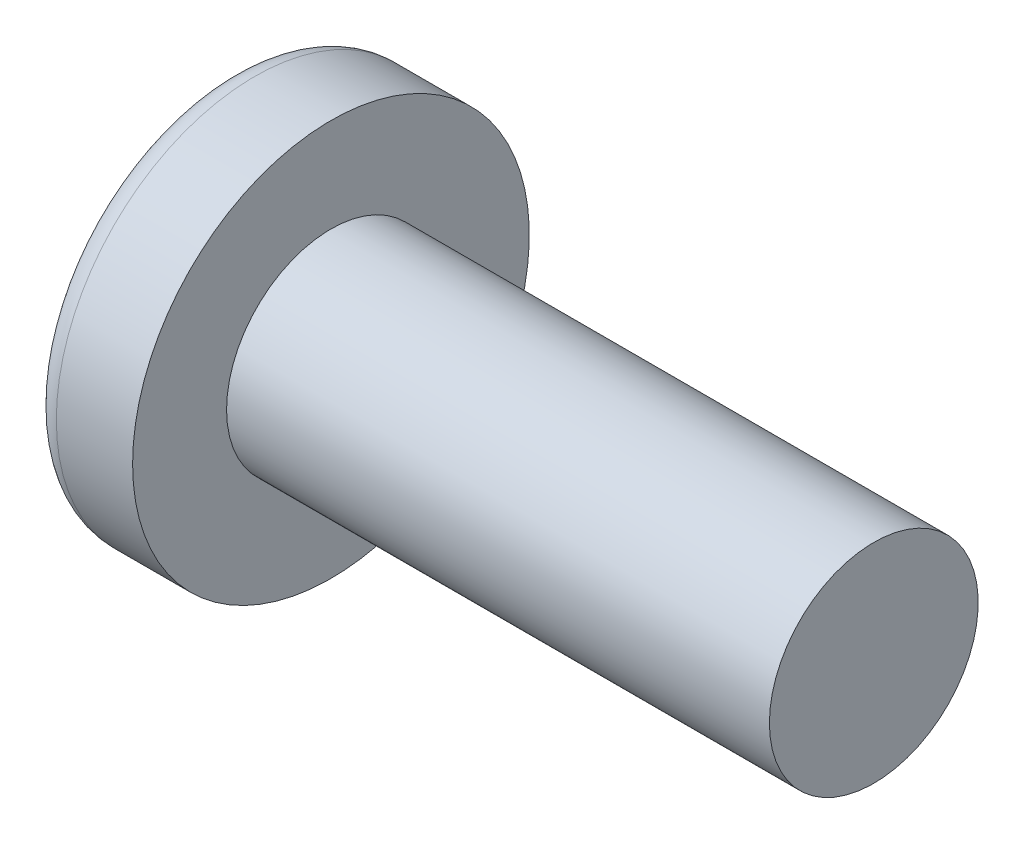
ISO-10303-21;
HEADER;
FILE_DESCRIPTION(('STEP AP214'),'2;1');
FILE_NAME('part.step','',(''),(''),'','','');
FILE_SCHEMA(('AUTOMOTIVE_DESIGN { 1 0 10303 214 1 1 1 1 }'));
ENDSEC;
DATA;
#1=APPLICATION_CONTEXT('core data for automotive mechanical design processes');
#2=APPLICATION_PROTOCOL_DEFINITION('international standard','automotive_design',2000,#1);
#3=PRODUCT_CONTEXT('',#1,'mechanical');
#4=PRODUCT('Part','Part','',(#3));
#5=PRODUCT_RELATED_PRODUCT_CATEGORY('part','',(#4));
#6=PRODUCT_DEFINITION_FORMATION('','',#4);
#7=PRODUCT_DEFINITION_CONTEXT('part definition',#1,'design');
#8=PRODUCT_DEFINITION('design','',#6,#7);
#9=PRODUCT_DEFINITION_SHAPE('','',#8);
#10=(LENGTH_UNIT() NAMED_UNIT(*) SI_UNIT(.MILLI.,.METRE.));
#11=(NAMED_UNIT(*) PLANE_ANGLE_UNIT() SI_UNIT($,.RADIAN.));
#12=(NAMED_UNIT(*) SI_UNIT($,.STERADIAN.) SOLID_ANGLE_UNIT());
#13=UNCERTAINTY_MEASURE_WITH_UNIT(LENGTH_MEASURE(1.E-05),#10,'distance_accuracy_value','');
#14=(GEOMETRIC_REPRESENTATION_CONTEXT(3) GLOBAL_UNCERTAINTY_ASSIGNED_CONTEXT((#13)) GLOBAL_UNIT_ASSIGNED_CONTEXT((#10,
#11,#12)) REPRESENTATION_CONTEXT('',''));
#15=CARTESIAN_POINT('',(0.,0.,0.));
#16=DIRECTION('',(0.,0.,1.));
#17=DIRECTION('',(1.,0.,0.));
#18=AXIS2_PLACEMENT_3D('',#15,#16,#17);
#19=CARTESIAN_POINT('',(8.,0.,0.));
#20=DIRECTION('',(-1.,0.,0.));
#21=DIRECTION('',(0.,1.,0.));
#22=AXIS2_PLACEMENT_3D('',#19,#20,#21);
#23=SPHERICAL_SURFACE('',#22,8.);
#24=CARTESIAN_POINT('',(1.37644815778014,0.,0.));
#25=DIRECTION('',(-1.,0.,0.));
#26=DIRECTION('',(0.,0.,1.));
#27=AXIS2_PLACEMENT_3D('',#24,#25,#26);
#28=CIRCLE('',#27,4.48648648648649);
#29=CARTESIAN_POINT('',(1.37644815778014,0.,4.48648648648649));
#30=VERTEX_POINT('',#29);
#31=EDGE_CURVE('E153',#30,#30,#28,.T.);
#32=ORIENTED_EDGE('',*,*,#31,.T.);
#33=EDGE_LOOP('',(#32));
#34=FACE_BOUND('',#33,.T.);
#35=CARTESIAN_POINT('',(7.98502567027952,-0.176697090701654,0.));
#36=DIRECTION('',(-0.0844430766861806,-0.996428304896931,0.));
#37=DIRECTION('',(0.996428304896931,-0.0844430766861806,0.));
#38=AXIS2_PLACEMENT_3D('',#35,#36,#37);
#39=CIRCLE('',#38,7.99803437774476);
#40=CARTESIAN_POINT('',(0.325131322777776,0.472446498069672,2.20752918301319));
#41=VERTEX_POINT('',#40);
#42=CARTESIAN_POINT('',(0.0309826509964153,0.497374351610472,0.497374351610473));
#43=VERTEX_POINT('',#42);
#44=EDGE_CURVE('E184',#41,#43,#39,.T.);
#45=ORIENTED_EDGE('',*,*,#44,.F.);
#46=CARTESIAN_POINT('',(6.31497138637622,0.,-2.25947018645006));
#47=DIRECTION('',(0.597823879730417,0.,0.801627475093059));
#48=DIRECTION('',(0.801627475093059,0.,-0.597823879730417));
#49=AXIS2_PLACEMENT_3D('',#46,#47,#48);
#50=CIRCLE('',#49,7.48702030502205);
#51=CARTESIAN_POINT('',(0.325131322777776,-0.472446498069688,2.20752918301319));
#52=VERTEX_POINT('',#51);
#53=EDGE_CURVE('E149',#41,#52,#50,.T.);
#54=ORIENTED_EDGE('',*,*,#53,.T.);
#55=CARTESIAN_POINT('',(7.98502567027952,0.176697090701654,0.));
#56=DIRECTION('',(-0.0844430766861805,0.996428304896931,0.));
#57=DIRECTION('',(-0.996428304896931,-0.0844430766861805,0.));
#58=AXIS2_PLACEMENT_3D('',#55,#56,#57);
#59=CIRCLE('',#58,7.99803437774476);
#60=CARTESIAN_POINT('',(0.0309826509964153,-0.497374351610475,0.497374351610473));
#61=VERTEX_POINT('',#60);
#62=EDGE_CURVE('E105',#61,#52,#59,.T.);
#63=ORIENTED_EDGE('',*,*,#62,.F.);
#64=CARTESIAN_POINT('',(7.98502567027952,0.,-0.176697090701654));
#65=DIRECTION('',(-0.0844430766861805,0.,-0.996428304896931));
#66=DIRECTION('',(-0.996428304896931,0.,0.0844430766861805));
#67=AXIS2_PLACEMENT_3D('',#64,#65,#66);
#68=CIRCLE('',#67,7.99803437774476);
#69=CARTESIAN_POINT('',(0.325131322777773,-2.20752918301319,0.47244649806968));
#70=VERTEX_POINT('',#69);
#71=EDGE_CURVE('E130',#70,#61,#68,.T.);
#72=ORIENTED_EDGE('',*,*,#71,.F.);
#73=CARTESIAN_POINT('',(6.31497138637622,2.25947018645006,0.));
#74=DIRECTION('',(0.597823879730417,-0.801627475093059,0.));
#75=DIRECTION('',(0.801627475093059,0.597823879730417,0.));
#76=AXIS2_PLACEMENT_3D('',#73,#74,#75);
#77=CIRCLE('',#76,7.48702030502205);
#78=CARTESIAN_POINT('',(0.325131322777775,-2.20752918301319,-0.47244649806968));
#79=VERTEX_POINT('',#78);
#80=EDGE_CURVE('E138',#70,#79,#77,.T.);
#81=ORIENTED_EDGE('',*,*,#80,.T.);
#82=CARTESIAN_POINT('',(7.98502567027952,0.,0.176697090701654));
#83=DIRECTION('',(-0.0844430766861806,0.,0.996428304896931));
#84=DIRECTION('',(0.996428304896931,0.,0.0844430766861806));
#85=AXIS2_PLACEMENT_3D('',#82,#83,#84);
#86=CIRCLE('',#85,7.99803437774476);
#87=CARTESIAN_POINT('',(0.0309826509964153,-0.497374351610471,-0.497374351610473));
#88=VERTEX_POINT('',#87);
#89=EDGE_CURVE('E48',#88,#79,#86,.T.);
#90=ORIENTED_EDGE('',*,*,#89,.F.);
#91=CARTESIAN_POINT('',(0.325131322777773,-0.472446498069672,-2.20752918301319));
#92=VERTEX_POINT('',#91);
#93=EDGE_CURVE('E191',#92,#88,#59,.T.);
#94=ORIENTED_EDGE('',*,*,#93,.F.);
#95=CARTESIAN_POINT('',(6.31497138637622,0.,2.25947018645006));
#96=DIRECTION('',(0.597823879730417,0.,-0.801627475093059));
#97=DIRECTION('',(-0.801627475093059,0.,-0.597823879730417));
#98=AXIS2_PLACEMENT_3D('',#95,#96,#97);
#99=CIRCLE('',#98,7.48702030502205);
#100=CARTESIAN_POINT('',(0.325131322777775,0.472446498069688,-2.20752918301318));
#101=VERTEX_POINT('',#100);
#102=EDGE_CURVE('E131',#92,#101,#99,.T.);
#103=ORIENTED_EDGE('',*,*,#102,.T.);
#104=CARTESIAN_POINT('',(0.0309826509964153,0.497374351610475,-0.497374351610473));
#105=VERTEX_POINT('',#104);
#106=EDGE_CURVE('E179',#105,#101,#39,.T.);
#107=ORIENTED_EDGE('',*,*,#106,.F.);
#108=CARTESIAN_POINT('',(0.325131322777776,2.20752918301319,-0.47244649806968));
#109=VERTEX_POINT('',#108);
#110=EDGE_CURVE('E41',#109,#105,#86,.T.);
#111=ORIENTED_EDGE('',*,*,#110,.F.);
#112=CARTESIAN_POINT('',(6.31497138637622,-2.25947018645006,0.));
#113=DIRECTION('',(0.597823879730417,0.801627475093059,0.));
#114=DIRECTION('',(-0.801627475093059,0.597823879730417,0.));
#115=AXIS2_PLACEMENT_3D('',#112,#113,#114);
#116=CIRCLE('',#115,7.48702030502205);
#117=CARTESIAN_POINT('',(0.325131322777776,2.20752918301319,0.47244649806968));
#118=VERTEX_POINT('',#117);
#119=EDGE_CURVE('E11',#109,#118,#116,.T.);
#120=ORIENTED_EDGE('',*,*,#119,.T.);
#121=EDGE_CURVE('E167',#43,#118,#68,.T.);
#122=ORIENTED_EDGE('',*,*,#121,.F.);
#123=EDGE_LOOP('',(#45,#54,#63,#72,#81,#90,#94,#103,#107,#111,#120,#122));
#124=FACE_BOUND('',#123,.T.);
#125=ADVANCED_FACE('F33',(#34,#124),#23,.T.);
#126=CARTESIAN_POINT('',(3.28522727272727,0.,-0.221590909090909));
#127=DIRECTION('',(-0.0844430766861806,0.,0.996428304896931));
#128=DIRECTION('',(0.996428304896931,0.,0.0844430766861806));
#129=AXIS2_PLACEMENT_3D('',#126,#127,#128);
#130=PLANE('',#129);
#131=ORIENTED_EDGE('',*,*,#110,.T.);
#132=DIRECTION('',(0.992894609445471,-0.0841436109699554,0.0841436109699551));
#133=VECTOR('',#132,1.);
#134=CARTESIAN_POINT('',(3.30374024870626,0.220022012821504,-0.220022012821503));
#135=LINE('',#134,#133);
#136=CARTESIAN_POINT('',(2.95,0.250000000000001,-0.249999999999999));
#137=VERTEX_POINT('',#136);
#138=EDGE_CURVE('E173',#105,#137,#135,.T.);
#139=ORIENTED_EDGE('',*,*,#138,.T.);
#140=DIRECTION('',(0.799784057588365,-0.596449127693018,0.0677783099651157));
#141=VECTOR('',#140,1.);
#142=CARTESIAN_POINT('',(0.,2.45,-0.5));
#143=LINE('',#142,#141);
#144=EDGE_CURVE('E154',#109,#137,#143,.T.);
#145=ORIENTED_EDGE('',*,*,#144,.F.);
#146=EDGE_LOOP('',(#131,#139,#145));
#147=FACE_BOUND('',#146,.T.);
#148=ADVANCED_FACE('F172',(#147),#130,.T.);
#149=DIRECTION('',(0.799784057588365,0.596449127693018,0.0677783099651157));
#150=VECTOR('',#149,1.);
#151=CARTESIAN_POINT('',(0.,-2.45,-0.5));
#152=LINE('',#151,#150);
#153=CARTESIAN_POINT('',(2.95,-0.25,-0.25));
#154=VERTEX_POINT('',#153);
#155=EDGE_CURVE('E139',#79,#154,#152,.T.);
#156=ORIENTED_EDGE('',*,*,#155,.T.);
#157=DIRECTION('',(-0.992894609445471,-0.0841436109699548,-0.0841436109699552));
#158=VECTOR('',#157,1.);
#159=CARTESIAN_POINT('',(3.30374024870626,-0.220022012821502,-0.220022012821503));
#160=LINE('',#159,#158);
#161=EDGE_CURVE('E194',#154,#88,#160,.T.);
#162=ORIENTED_EDGE('',*,*,#161,.T.);
#163=ORIENTED_EDGE('',*,*,#89,.T.);
#164=EDGE_LOOP('',(#156,#162,#163));
#165=FACE_BOUND('',#164,.T.);
#166=ADVANCED_FACE('F209',(#165),#130,.T.);
#167=CARTESIAN_POINT('',(3.28522727272727,0.,0.221590909090909));
#168=DIRECTION('',(-0.0844430766861805,0.,-0.996428304896931));
#169=DIRECTION('',(-0.996428304896931,0.,0.0844430766861805));
#170=AXIS2_PLACEMENT_3D('',#167,#168,#169);
#171=PLANE('',#170);
#172=DIRECTION('',(0.799784057588365,-0.596449127693018,-0.0677783099651157));
#173=VECTOR('',#172,1.);
#174=CARTESIAN_POINT('',(0.,2.45,0.5));
#175=LINE('',#174,#173);
#176=CARTESIAN_POINT('',(2.95,0.25,0.25));
#177=VERTEX_POINT('',#176);
#178=EDGE_CURVE('E210',#118,#177,#175,.T.);
#179=ORIENTED_EDGE('',*,*,#178,.T.);
#180=DIRECTION('',(-0.992894609445471,0.0841436109699549,0.0841436109699551));
#181=VECTOR('',#180,1.);
#182=CARTESIAN_POINT('',(3.30374024870626,0.220022012821502,0.220022012821503));
#183=LINE('',#182,#181);
#184=EDGE_CURVE('E188',#177,#43,#183,.T.);
#185=ORIENTED_EDGE('',*,*,#184,.T.);
#186=ORIENTED_EDGE('',*,*,#121,.T.);
#187=EDGE_LOOP('',(#179,#185,#186));
#188=FACE_BOUND('',#187,.T.);
#189=ADVANCED_FACE('F214',(#188),#171,.T.);
#190=ORIENTED_EDGE('',*,*,#71,.T.);
#191=DIRECTION('',(0.992894609445471,0.0841436109699554,-0.0841436109699551));
#192=VECTOR('',#191,1.);
#193=CARTESIAN_POINT('',(3.30374024870626,-0.220022012821504,0.220022012821503));
#194=LINE('',#193,#192);
#195=CARTESIAN_POINT('',(2.95,-0.250000000000001,0.249999999999999));
#196=VERTEX_POINT('',#195);
#197=EDGE_CURVE('E103',#61,#196,#194,.T.);
#198=ORIENTED_EDGE('',*,*,#197,.T.);
#199=DIRECTION('',(0.799784057588366,0.596449127693018,-0.0677783099651156));
#200=VECTOR('',#199,1.);
#201=CARTESIAN_POINT('',(0.,-2.45,0.5));
#202=LINE('',#201,#200);
#203=EDGE_CURVE('E128',#70,#196,#202,.T.);
#204=ORIENTED_EDGE('',*,*,#203,.F.);
#205=EDGE_LOOP('',(#190,#198,#204));
#206=FACE_BOUND('',#205,.T.);
#207=ADVANCED_FACE('F127',(#206),#171,.T.);
#208=CARTESIAN_POINT('',(-25.4,0.,0.));
#209=DIRECTION('',(-1.,0.,0.));
#210=DIRECTION('',(0.,0.,1.));
#211=AXIS2_PLACEMENT_3D('',#208,#209,#210);
#212=CYLINDRICAL_SURFACE('',#211,2.5);
#213=CARTESIAN_POINT('',(16.7,0.,0.));
#214=DIRECTION('',(-1.,0.,0.));
#215=DIRECTION('',(0.,0.,1.));
#216=AXIS2_PLACEMENT_3D('',#213,#214,#215);
#217=CIRCLE('',#216,2.5);
#218=CARTESIAN_POINT('',(16.7,0.,2.5));
#219=VERTEX_POINT('',#218);
#220=EDGE_CURVE('E150',#219,#219,#217,.T.);
#221=ORIENTED_EDGE('',*,*,#220,.T.);
#222=EDGE_LOOP('',(#221));
#223=FACE_BOUND('',#222,.T.);
#224=CARTESIAN_POINT('',(3.7,0.,0.));
#225=DIRECTION('',(-1.,0.,0.));
#226=DIRECTION('',(0.,0.,1.));
#227=AXIS2_PLACEMENT_3D('',#224,#225,#226);
#228=CIRCLE('',#227,2.5);
#229=CARTESIAN_POINT('',(3.7,0.,2.5));
#230=VERTEX_POINT('',#229);
#231=EDGE_CURVE('E163',#230,#230,#228,.T.);
#232=ORIENTED_EDGE('',*,*,#231,.F.);
#233=EDGE_LOOP('',(#232));
#234=FACE_BOUND('',#233,.T.);
#235=ADVANCED_FACE('F35',(#223,#234),#212,.T.);
#236=CARTESIAN_POINT('',(3.7,2.5,0.));
#237=DIRECTION('',(-1.,0.,0.));
#238=DIRECTION('',(0.,0.,1.));
#239=AXIS2_PLACEMENT_3D('',#236,#237,#238);
#240=PLANE('',#239);
#241=CARTESIAN_POINT('',(3.7,0.,0.));
#242=DIRECTION('',(-1.,0.,0.));
#243=DIRECTION('',(0.,0.,1.));
#244=AXIS2_PLACEMENT_3D('',#241,#242,#243);
#245=CIRCLE('',#244,4.75);
#246=CARTESIAN_POINT('',(3.7,0.,4.75));
#247=VERTEX_POINT('',#246);
#248=EDGE_CURVE('E160',#247,#247,#245,.T.);
#249=ORIENTED_EDGE('',*,*,#248,.F.);
#250=EDGE_LOOP('',(#249));
#251=FACE_BOUND('',#250,.T.);
#252=ORIENTED_EDGE('',*,*,#231,.T.);
#253=EDGE_LOOP('',(#252));
#254=FACE_BOUND('',#253,.T.);
#255=ADVANCED_FACE('F242',(#251,#254),#240,.F.);
#256=CARTESIAN_POINT('',(-25.4,0.,0.));
#257=DIRECTION('',(-1.,0.,0.));
#258=DIRECTION('',(0.,0.,1.));
#259=AXIS2_PLACEMENT_3D('',#256,#257,#258);
#260=CYLINDRICAL_SURFACE('',#259,4.75);
#261=ORIENTED_EDGE('',*,*,#248,.T.);
#262=EDGE_LOOP('',(#261));
#263=FACE_BOUND('',#262,.T.);
#264=CARTESIAN_POINT('',(1.87321454594663,0.,0.));
#265=DIRECTION('',(-1.,0.,0.));
#266=DIRECTION('',(0.,0.,1.));
#267=AXIS2_PLACEMENT_3D('',#264,#265,#266);
#268=CIRCLE('',#267,4.75);
#269=CARTESIAN_POINT('',(1.87321454594663,0.,4.75));
#270=VERTEX_POINT('',#269);
#271=EDGE_CURVE('E157',#270,#270,#268,.T.);
#272=ORIENTED_EDGE('',*,*,#271,.F.);
#273=EDGE_LOOP('',(#272));
#274=FACE_BOUND('',#273,.T.);
#275=ADVANCED_FACE('F239',(#263,#274),#260,.T.);
#276=CARTESIAN_POINT('',(1.87321454594663,0.,0.));
#277=DIRECTION('',(-1.,0.,0.));
#278=DIRECTION('',(0.,0.,1.));
#279=AXIS2_PLACEMENT_3D('',#276,#277,#278);
#280=TOROIDAL_SURFACE('',#279,4.15,0.6);
#281=ORIENTED_EDGE('',*,*,#271,.T.);
#282=EDGE_LOOP('',(#281));
#283=FACE_BOUND('',#282,.T.);
#284=ORIENTED_EDGE('',*,*,#31,.F.);
#285=EDGE_LOOP('',(#284));
#286=FACE_BOUND('',#285,.T.);
#287=ADVANCED_FACE('F236',(#283,#286),#280,.T.);
#288=CARTESIAN_POINT('',(16.7,2.5,0.));
#289=DIRECTION('',(1.,0.,0.));
#290=DIRECTION('',(0.,0.,-1.));
#291=AXIS2_PLACEMENT_3D('',#288,#289,#290);
#292=PLANE('',#291);
#293=ORIENTED_EDGE('',*,*,#220,.F.);
#294=EDGE_LOOP('',(#293));
#295=FACE_BOUND('',#294,.T.);
#296=ADVANCED_FACE('F234',(#295),#292,.T.);
#297=CARTESIAN_POINT('',(2.95,0.25,0.25));
#298=DIRECTION('',(0.597823879730417,0.801627475093059,0.));
#299=DIRECTION('',(-0.801627475093059,0.597823879730417,0.));
#300=AXIS2_PLACEMENT_3D('',#297,#298,#299);
#301=PLANE('',#300);
#302=ORIENTED_EDGE('',*,*,#144,.T.);
#303=DIRECTION('',(0.,0.,-1.));
#304=VECTOR('',#303,1.);
#305=CARTESIAN_POINT('',(2.95,0.25,0.25));
#306=LINE('',#305,#304);
#307=EDGE_CURVE('E121',#177,#137,#306,.T.);
#308=ORIENTED_EDGE('',*,*,#307,.F.);
#309=ORIENTED_EDGE('',*,*,#178,.F.);
#310=ORIENTED_EDGE('',*,*,#119,.F.);
#311=EDGE_LOOP('',(#302,#308,#309,#310));
#312=FACE_BOUND('',#311,.T.);
#313=ADVANCED_FACE('F213',(#312),#301,.F.);
#314=CARTESIAN_POINT('',(2.95,-0.25,-0.25));
#315=DIRECTION('',(0.597823879730417,-0.801627475093059,0.));
#316=DIRECTION('',(0.801627475093059,0.597823879730417,0.));
#317=AXIS2_PLACEMENT_3D('',#314,#315,#316);
#318=PLANE('',#317);
#319=ORIENTED_EDGE('',*,*,#203,.T.);
#320=DIRECTION('',(0.,0.,1.));
#321=VECTOR('',#320,1.);
#322=CARTESIAN_POINT('',(2.95,-0.25,-0.25));
#323=LINE('',#322,#321);
#324=EDGE_CURVE('E120',#154,#196,#323,.T.);
#325=ORIENTED_EDGE('',*,*,#324,.F.);
#326=ORIENTED_EDGE('',*,*,#155,.F.);
#327=ORIENTED_EDGE('',*,*,#80,.F.);
#328=EDGE_LOOP('',(#319,#325,#326,#327));
#329=FACE_BOUND('',#328,.T.);
#330=ADVANCED_FACE('F135',(#329),#318,.F.);
#331=CARTESIAN_POINT('',(2.95,0.25,-0.25));
#332=DIRECTION('',(-1.,0.,0.));
#333=DIRECTION('',(0.,0.,1.));
#334=AXIS2_PLACEMENT_3D('',#331,#332,#333);
#335=PLANE('',#334);
#336=DIRECTION('',(0.,1.,0.));
#337=VECTOR('',#336,1.);
#338=CARTESIAN_POINT('',(2.95,-0.25,-0.25));
#339=LINE('',#338,#337);
#340=EDGE_CURVE('E143',#154,#137,#339,.T.);
#341=ORIENTED_EDGE('',*,*,#340,.F.);
#342=ORIENTED_EDGE('',*,*,#324,.T.);
#343=DIRECTION('',(0.,-1.,0.));
#344=VECTOR('',#343,1.);
#345=CARTESIAN_POINT('',(2.95,0.25,0.25));
#346=LINE('',#345,#344);
#347=EDGE_CURVE('E112',#177,#196,#346,.T.);
#348=ORIENTED_EDGE('',*,*,#347,.F.);
#349=ORIENTED_EDGE('',*,*,#307,.T.);
#350=EDGE_LOOP('',(#341,#342,#348,#349));
#351=FACE_BOUND('',#350,.T.);
#352=ADVANCED_FACE('F141',(#351),#335,.T.);
#353=CARTESIAN_POINT('',(2.95,0.250000000000001,-0.249999999999999));
#354=DIRECTION('',(0.597823879730417,0.,-0.801627475093059));
#355=DIRECTION('',(0.801627475093059,0.,0.597823879730417));
#356=AXIS2_PLACEMENT_3D('',#353,#354,#355);
#357=PLANE('',#356);
#358=DIRECTION('',(0.799784057588366,0.0677783099651135,0.596449127693019));
#359=VECTOR('',#358,1.);
#360=CARTESIAN_POINT('',(0.,-0.499999999999991,-2.45));
#361=LINE('',#360,#359);
#362=EDGE_CURVE('E199',#92,#154,#361,.T.);
#363=ORIENTED_EDGE('',*,*,#362,.T.);
#364=ORIENTED_EDGE('',*,*,#340,.T.);
#365=DIRECTION('',(0.799784057588365,-0.0677783099651178,0.596449127693018));
#366=VECTOR('',#365,1.);
#367=CARTESIAN_POINT('',(0.,0.500000000000009,-2.45));
#368=LINE('',#367,#366);
#369=EDGE_CURVE('E109',#101,#137,#368,.T.);
#370=ORIENTED_EDGE('',*,*,#369,.F.);
#371=ORIENTED_EDGE('',*,*,#102,.F.);
#372=EDGE_LOOP('',(#363,#364,#370,#371));
#373=FACE_BOUND('',#372,.T.);
#374=ADVANCED_FACE('F204',(#373),#357,.F.);
#375=CARTESIAN_POINT('',(3.28522727272727,-0.221590909090909,0.));
#376=DIRECTION('',(-0.0844430766861805,0.996428304896931,0.));
#377=DIRECTION('',(-0.996428304896931,-0.0844430766861805,0.));
#378=AXIS2_PLACEMENT_3D('',#375,#376,#377);
#379=PLANE('',#378);
#380=ORIENTED_EDGE('',*,*,#93,.T.);
#381=ORIENTED_EDGE('',*,*,#161,.F.);
#382=ORIENTED_EDGE('',*,*,#362,.F.);
#383=EDGE_LOOP('',(#380,#381,#382));
#384=FACE_BOUND('',#383,.T.);
#385=ADVANCED_FACE('F208',(#384),#379,.T.);
#386=CARTESIAN_POINT('',(3.28522727272727,0.221590909090909,0.));
#387=DIRECTION('',(-0.0844430766861806,-0.996428304896931,0.));
#388=DIRECTION('',(0.996428304896931,-0.0844430766861806,0.));
#389=AXIS2_PLACEMENT_3D('',#386,#387,#388);
#390=PLANE('',#389);
#391=ORIENTED_EDGE('',*,*,#106,.T.);
#392=ORIENTED_EDGE('',*,*,#369,.T.);
#393=ORIENTED_EDGE('',*,*,#138,.F.);
#394=EDGE_LOOP('',(#391,#392,#393));
#395=FACE_BOUND('',#394,.T.);
#396=ADVANCED_FACE('F202',(#395),#390,.T.);
#397=CARTESIAN_POINT('',(2.95,-0.250000000000001,0.249999999999999));
#398=DIRECTION('',(0.597823879730417,0.,0.801627475093059));
#399=DIRECTION('',(-0.801627475093059,0.,0.597823879730417));
#400=AXIS2_PLACEMENT_3D('',#397,#398,#399);
#401=PLANE('',#400);
#402=DIRECTION('',(0.799784057588365,-0.0677783099651136,-0.596449127693019));
#403=VECTOR('',#402,1.);
#404=CARTESIAN_POINT('',(0.,0.499999999999991,2.45));
#405=LINE('',#404,#403);
#406=EDGE_CURVE('E108',#41,#177,#405,.T.);
#407=ORIENTED_EDGE('',*,*,#406,.T.);
#408=ORIENTED_EDGE('',*,*,#347,.T.);
#409=DIRECTION('',(0.799784057588365,0.0677783099651178,-0.596449127693018));
#410=VECTOR('',#409,1.);
#411=CARTESIAN_POINT('',(0.,-0.500000000000009,2.45));
#412=LINE('',#411,#410);
#413=EDGE_CURVE('E99',#52,#196,#412,.T.);
#414=ORIENTED_EDGE('',*,*,#413,.F.);
#415=ORIENTED_EDGE('',*,*,#53,.F.);
#416=EDGE_LOOP('',(#407,#408,#414,#415));
#417=FACE_BOUND('',#416,.T.);
#418=ADVANCED_FACE('F113',(#417),#401,.F.);
#419=ORIENTED_EDGE('',*,*,#44,.T.);
#420=ORIENTED_EDGE('',*,*,#184,.F.);
#421=ORIENTED_EDGE('',*,*,#406,.F.);
#422=EDGE_LOOP('',(#419,#420,#421));
#423=FACE_BOUND('',#422,.T.);
#424=ADVANCED_FACE('F215',(#423),#390,.T.);
#425=ORIENTED_EDGE('',*,*,#62,.T.);
#426=ORIENTED_EDGE('',*,*,#413,.T.);
#427=ORIENTED_EDGE('',*,*,#197,.F.);
#428=EDGE_LOOP('',(#425,#426,#427));
#429=FACE_BOUND('',#428,.T.);
#430=ADVANCED_FACE('F101',(#429),#379,.T.);
#431=CLOSED_SHELL('',(#125,#148,#166,#189,#207,#235,#255,#275,#287,#296,#313,#330,#352,#374,
#385,#396,#418,#424,#430));
#432=MANIFOLD_SOLID_BREP('B2',#431);
#433=ADVANCED_BREP_SHAPE_REPRESENTATION('',(#18,#432),#14);
#434=SHAPE_DEFINITION_REPRESENTATION(#9,#433);
ENDSEC;
END-ISO-10303-21;
